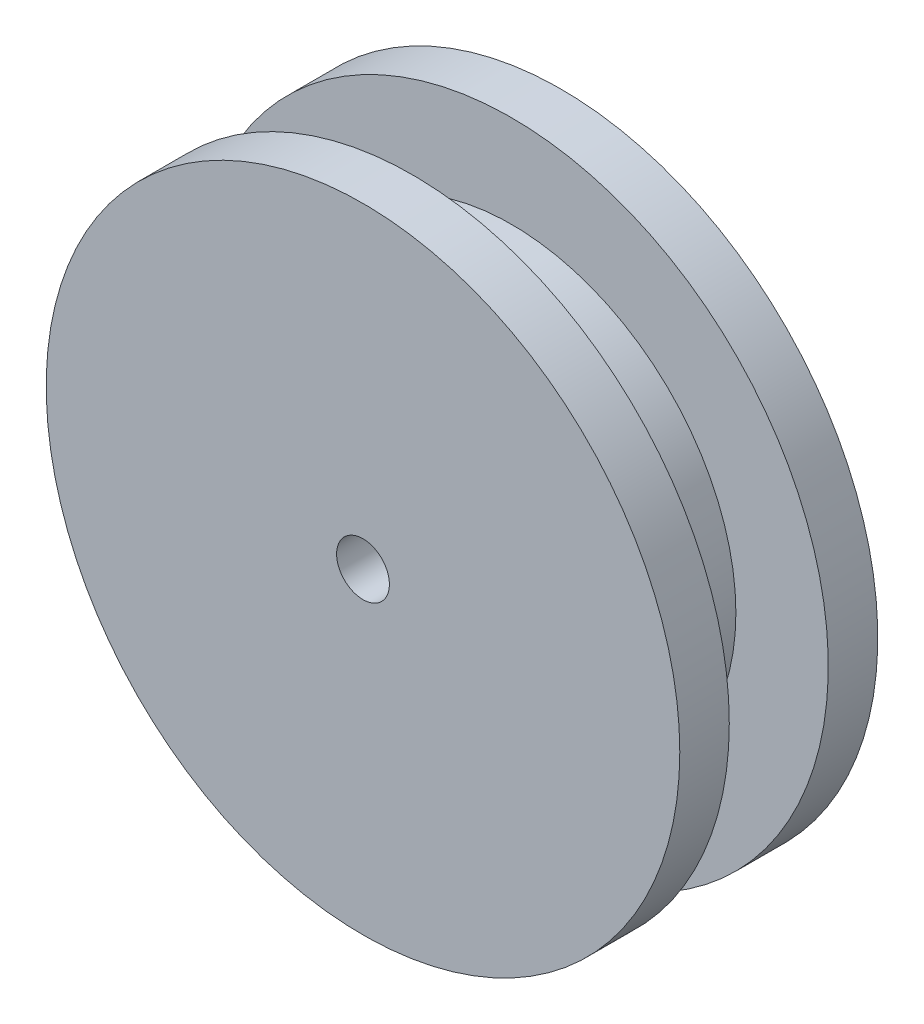
ISO-10303-21;
HEADER;
FILE_DESCRIPTION(('STEP AP214'),'2;1');
FILE_NAME('part.step','',(''),(''),'','','');
FILE_SCHEMA(('AUTOMOTIVE_DESIGN { 1 0 10303 214 1 1 1 1 }'));
ENDSEC;
DATA;
#1=APPLICATION_CONTEXT('core data for automotive mechanical design processes');
#2=APPLICATION_PROTOCOL_DEFINITION('international standard','automotive_design',2000,#1);
#3=PRODUCT_CONTEXT('',#1,'mechanical');
#4=PRODUCT('Part','Part','',(#3));
#5=PRODUCT_RELATED_PRODUCT_CATEGORY('part','',(#4));
#6=PRODUCT_DEFINITION_FORMATION('','',#4);
#7=PRODUCT_DEFINITION_CONTEXT('part definition',#1,'design');
#8=PRODUCT_DEFINITION('design','',#6,#7);
#9=PRODUCT_DEFINITION_SHAPE('','',#8);
#10=(LENGTH_UNIT() NAMED_UNIT(*) SI_UNIT(.MILLI.,.METRE.));
#11=(NAMED_UNIT(*) PLANE_ANGLE_UNIT() SI_UNIT($,.RADIAN.));
#12=(NAMED_UNIT(*) SI_UNIT($,.STERADIAN.) SOLID_ANGLE_UNIT());
#13=UNCERTAINTY_MEASURE_WITH_UNIT(LENGTH_MEASURE(1.E-05),#10,'distance_accuracy_value','');
#14=(GEOMETRIC_REPRESENTATION_CONTEXT(3) GLOBAL_UNCERTAINTY_ASSIGNED_CONTEXT((#13)) GLOBAL_UNIT_ASSIGNED_CONTEXT((#10,
#11,#12)) REPRESENTATION_CONTEXT('',''));
#15=CARTESIAN_POINT('',(0.,0.,0.));
#16=DIRECTION('',(0.,0.,1.));
#17=DIRECTION('',(1.,0.,0.));
#18=AXIS2_PLACEMENT_3D('',#15,#16,#17);
#19=CARTESIAN_POINT('',(0.,0.,15.));
#20=DIRECTION('',(0.,0.,-1.));
#21=DIRECTION('',(-1.,0.,0.));
#22=AXIS2_PLACEMENT_3D('',#19,#20,#21);
#23=CYLINDRICAL_SURFACE('',#22,34.);
#24=CARTESIAN_POINT('',(0.,0.,15.));
#25=DIRECTION('',(0.,0.,1.));
#26=DIRECTION('',(1.,0.,0.));
#27=AXIS2_PLACEMENT_3D('',#24,#25,#26);
#28=CIRCLE('',#27,34.);
#29=CARTESIAN_POINT('',(34.,0.,15.));
#30=VERTEX_POINT('',#29);
#31=EDGE_CURVE('E10',#30,#30,#28,.T.);
#32=ORIENTED_EDGE('',*,*,#31,.F.);
#33=EDGE_LOOP('',(#32));
#34=FACE_BOUND('',#33,.T.);
#35=CARTESIAN_POINT('',(0.,0.,0.));
#36=DIRECTION('',(0.,0.,1.));
#37=DIRECTION('',(1.,0.,0.));
#38=AXIS2_PLACEMENT_3D('',#35,#36,#37);
#39=CIRCLE('',#38,34.);
#40=CARTESIAN_POINT('',(34.,0.,0.));
#41=VERTEX_POINT('',#40);
#42=EDGE_CURVE('E37',#41,#41,#39,.T.);
#43=ORIENTED_EDGE('',*,*,#42,.T.);
#44=EDGE_LOOP('',(#43));
#45=FACE_BOUND('',#44,.T.);
#46=ADVANCED_FACE('F34',(#34,#45),#23,.T.);
#47=CARTESIAN_POINT('',(0.,0.,22.5));
#48=DIRECTION('',(0.,0.,-1.));
#49=DIRECTION('',(-1.,0.,0.));
#50=AXIS2_PLACEMENT_3D('',#47,#48,#49);
#51=CYLINDRICAL_SURFACE('',#50,48.);
#52=CARTESIAN_POINT('',(0.,0.,22.5));
#53=DIRECTION('',(0.,0.,1.));
#54=DIRECTION('',(1.,0.,0.));
#55=AXIS2_PLACEMENT_3D('',#52,#53,#54);
#56=CIRCLE('',#55,48.);
#57=CARTESIAN_POINT('',(48.,0.,22.5));
#58=VERTEX_POINT('',#57);
#59=EDGE_CURVE('E41',#58,#58,#56,.T.);
#60=ORIENTED_EDGE('',*,*,#59,.F.);
#61=EDGE_LOOP('',(#60));
#62=FACE_BOUND('',#61,.T.);
#63=CARTESIAN_POINT('',(0.,0.,15.));
#64=DIRECTION('',(0.,0.,1.));
#65=DIRECTION('',(1.,0.,0.));
#66=AXIS2_PLACEMENT_3D('',#63,#64,#65);
#67=CIRCLE('',#66,48.);
#68=CARTESIAN_POINT('',(48.,0.,15.));
#69=VERTEX_POINT('',#68);
#70=EDGE_CURVE('E45',#69,#69,#67,.T.);
#71=ORIENTED_EDGE('',*,*,#70,.T.);
#72=EDGE_LOOP('',(#71));
#73=FACE_BOUND('',#72,.T.);
#74=ADVANCED_FACE('F93',(#62,#73),#51,.T.);
#75=CARTESIAN_POINT('',(0.,0.,22.5));
#76=DIRECTION('',(0.,0.,1.));
#77=DIRECTION('',(1.,0.,0.));
#78=AXIS2_PLACEMENT_3D('',#75,#76,#77);
#79=PLANE('',#78);
#80=CARTESIAN_POINT('',(0.,0.,22.5));
#81=DIRECTION('',(0.,0.,-1.));
#82=DIRECTION('',(-1.,0.,0.));
#83=AXIS2_PLACEMENT_3D('',#80,#81,#82);
#84=CIRCLE('',#83,4.);
#85=CARTESIAN_POINT('',(-4.,0.,22.5));
#86=VERTEX_POINT('',#85);
#87=EDGE_CURVE('E54',#86,#86,#84,.T.);
#88=ORIENTED_EDGE('',*,*,#87,.T.);
#89=EDGE_LOOP('',(#88));
#90=FACE_BOUND('',#89,.T.);
#91=ORIENTED_EDGE('',*,*,#59,.T.);
#92=EDGE_LOOP('',(#91));
#93=FACE_BOUND('',#92,.T.);
#94=ADVANCED_FACE('F63',(#90,#93),#79,.T.);
#95=CARTESIAN_POINT('',(0.,0.,15.));
#96=DIRECTION('',(0.,0.,1.));
#97=DIRECTION('',(1.,0.,0.));
#98=AXIS2_PLACEMENT_3D('',#95,#96,#97);
#99=PLANE('',#98);
#100=ORIENTED_EDGE('',*,*,#31,.T.);
#101=EDGE_LOOP('',(#100));
#102=FACE_BOUND('',#101,.T.);
#103=ORIENTED_EDGE('',*,*,#70,.F.);
#104=EDGE_LOOP('',(#103));
#105=FACE_BOUND('',#104,.T.);
#106=ADVANCED_FACE('F82',(#102,#105),#99,.F.);
#107=CARTESIAN_POINT('',(0.,0.,-7.5));
#108=DIRECTION('',(0.,0.,1.));
#109=DIRECTION('',(1.,0.,0.));
#110=AXIS2_PLACEMENT_3D('',#107,#108,#109);
#111=CYLINDRICAL_SURFACE('',#110,48.);
#112=CARTESIAN_POINT('',(0.,0.,-7.5));
#113=DIRECTION('',(0.,0.,-1.));
#114=DIRECTION('',(-1.,0.,0.));
#115=AXIS2_PLACEMENT_3D('',#112,#113,#114);
#116=CIRCLE('',#115,48.);
#117=CARTESIAN_POINT('',(-48.,0.,-7.5));
#118=VERTEX_POINT('',#117);
#119=EDGE_CURVE('E53',#118,#118,#116,.T.);
#120=ORIENTED_EDGE('',*,*,#119,.F.);
#121=EDGE_LOOP('',(#120));
#122=FACE_BOUND('',#121,.T.);
#123=CARTESIAN_POINT('',(0.,0.,0.));
#124=DIRECTION('',(0.,0.,-1.));
#125=DIRECTION('',(-1.,0.,0.));
#126=AXIS2_PLACEMENT_3D('',#123,#124,#125);
#127=CIRCLE('',#126,48.);
#128=CARTESIAN_POINT('',(-48.,0.,0.));
#129=VERTEX_POINT('',#128);
#130=EDGE_CURVE('E50',#129,#129,#127,.T.);
#131=ORIENTED_EDGE('',*,*,#130,.T.);
#132=EDGE_LOOP('',(#131));
#133=FACE_BOUND('',#132,.T.);
#134=ADVANCED_FACE('F76',(#122,#133),#111,.T.);
#135=CARTESIAN_POINT('',(0.,0.,-7.5));
#136=DIRECTION('',(0.,0.,-1.));
#137=DIRECTION('',(-1.,0.,0.));
#138=AXIS2_PLACEMENT_3D('',#135,#136,#137);
#139=PLANE('',#138);
#140=CARTESIAN_POINT('',(0.,0.,-7.5));
#141=DIRECTION('',(0.,0.,-1.));
#142=DIRECTION('',(-1.,0.,0.));
#143=AXIS2_PLACEMENT_3D('',#140,#141,#142);
#144=CIRCLE('',#143,4.);
#145=CARTESIAN_POINT('',(-4.,0.,-7.5));
#146=VERTEX_POINT('',#145);
#147=EDGE_CURVE('E57',#146,#146,#144,.T.);
#148=ORIENTED_EDGE('',*,*,#147,.F.);
#149=EDGE_LOOP('',(#148));
#150=FACE_BOUND('',#149,.T.);
#151=ORIENTED_EDGE('',*,*,#119,.T.);
#152=EDGE_LOOP('',(#151));
#153=FACE_BOUND('',#152,.T.);
#154=ADVANCED_FACE('F73',(#150,#153),#139,.T.);
#155=CARTESIAN_POINT('',(0.,0.,0.));
#156=DIRECTION('',(0.,0.,-1.));
#157=DIRECTION('',(-1.,0.,0.));
#158=AXIS2_PLACEMENT_3D('',#155,#156,#157);
#159=PLANE('',#158);
#160=ORIENTED_EDGE('',*,*,#42,.F.);
#161=EDGE_LOOP('',(#160));
#162=FACE_BOUND('',#161,.T.);
#163=ORIENTED_EDGE('',*,*,#130,.F.);
#164=EDGE_LOOP('',(#163));
#165=FACE_BOUND('',#164,.T.);
#166=ADVANCED_FACE('F69',(#162,#165),#159,.F.);
#167=CARTESIAN_POINT('',(0.,0.,22.5));
#168=DIRECTION('',(0.,0.,-1.));
#169=DIRECTION('',(-1.,0.,0.));
#170=AXIS2_PLACEMENT_3D('',#167,#168,#169);
#171=CYLINDRICAL_SURFACE('',#170,4.);
#172=ORIENTED_EDGE('',*,*,#87,.F.);
#173=EDGE_LOOP('',(#172));
#174=FACE_BOUND('',#173,.T.);
#175=ORIENTED_EDGE('',*,*,#147,.T.);
#176=EDGE_LOOP('',(#175));
#177=FACE_BOUND('',#176,.T.);
#178=ADVANCED_FACE('F66',(#174,#177),#171,.F.);
#179=CLOSED_SHELL('',(#46,#74,#94,#106,#134,#154,#166,#178));
#180=MANIFOLD_SOLID_BREP('B2',#179);
#181=ADVANCED_BREP_SHAPE_REPRESENTATION('',(#18,#180),#14);
#182=SHAPE_DEFINITION_REPRESENTATION(#9,#181);
ENDSEC;
END-ISO-10303-21;
